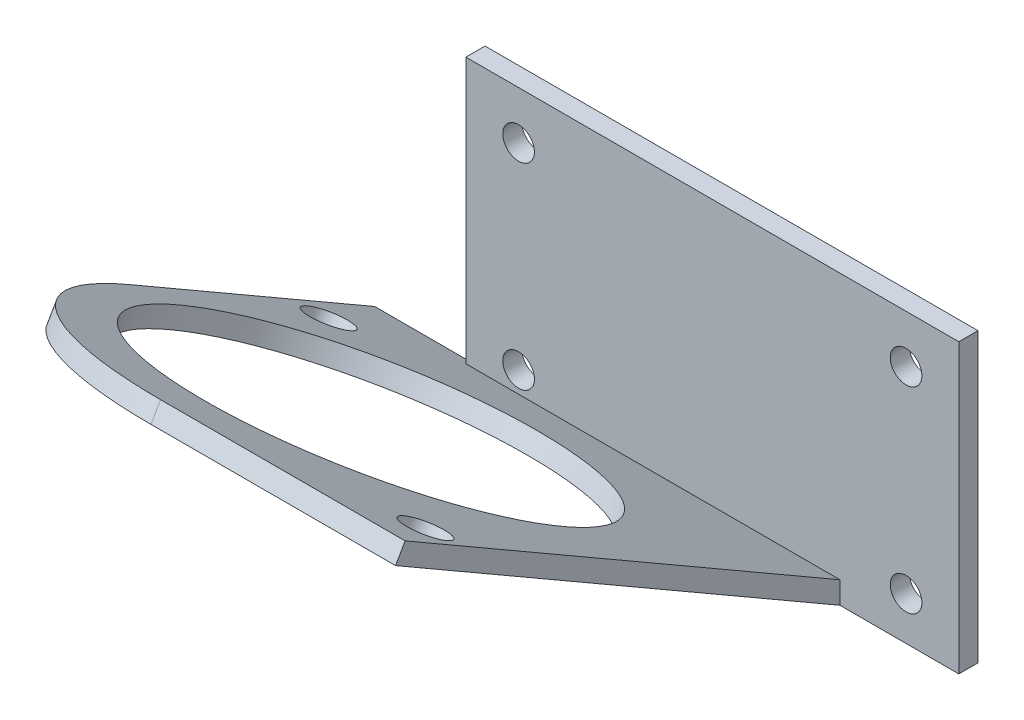
ISO-10303-21;
HEADER;
FILE_DESCRIPTION(('STEP AP214'),'2;1');
FILE_NAME('part.step','',(''),(''),'','','');
FILE_SCHEMA(('AUTOMOTIVE_DESIGN { 1 0 10303 214 1 1 1 1 }'));
ENDSEC;
DATA;
#1=APPLICATION_CONTEXT('core data for automotive mechanical design processes');
#2=APPLICATION_PROTOCOL_DEFINITION('international standard','automotive_design',2000,#1);
#3=PRODUCT_CONTEXT('',#1,'mechanical');
#4=PRODUCT('Part','Part','',(#3));
#5=PRODUCT_RELATED_PRODUCT_CATEGORY('part','',(#4));
#6=PRODUCT_DEFINITION_FORMATION('','',#4);
#7=PRODUCT_DEFINITION_CONTEXT('part definition',#1,'design');
#8=PRODUCT_DEFINITION('design','',#6,#7);
#9=PRODUCT_DEFINITION_SHAPE('','',#8);
#10=(LENGTH_UNIT() NAMED_UNIT(*) SI_UNIT(.MILLI.,.METRE.));
#11=(NAMED_UNIT(*) PLANE_ANGLE_UNIT() SI_UNIT($,.RADIAN.));
#12=(NAMED_UNIT(*) SI_UNIT($,.STERADIAN.) SOLID_ANGLE_UNIT());
#13=UNCERTAINTY_MEASURE_WITH_UNIT(LENGTH_MEASURE(1.E-05),#10,'distance_accuracy_value','');
#14=(GEOMETRIC_REPRESENTATION_CONTEXT(3) GLOBAL_UNCERTAINTY_ASSIGNED_CONTEXT((#13)) GLOBAL_UNIT_ASSIGNED_CONTEXT((#10,
#11,#12)) REPRESENTATION_CONTEXT('',''));
#15=CARTESIAN_POINT('',(0.,0.,0.));
#16=DIRECTION('',(0.,0.,1.));
#17=DIRECTION('',(1.,0.,0.));
#18=AXIS2_PLACEMENT_3D('',#15,#16,#17);
#19=CARTESIAN_POINT('',(0.,0.,2.));
#20=DIRECTION('',(1.,0.,0.));
#21=DIRECTION('',(0.,0.,-1.));
#22=AXIS2_PLACEMENT_3D('',#19,#20,#21);
#23=PLANE('',#22);
#24=DIRECTION('',(0.,0.,-1.));
#25=VECTOR('',#24,1.);
#26=CARTESIAN_POINT('',(0.,0.,2.));
#27=LINE('',#26,#25);
#28=CARTESIAN_POINT('',(0.,0.,2.));
#29=VERTEX_POINT('',#28);
#30=CARTESIAN_POINT('',(0.,0.,0.));
#31=VERTEX_POINT('',#30);
#32=EDGE_CURVE('E210',#29,#31,#27,.T.);
#33=ORIENTED_EDGE('',*,*,#32,.F.);
#34=DIRECTION('',(0.,0.86602540378444,-0.499999999999998));
#35=VECTOR('',#34,1.);
#36=CARTESIAN_POINT('',(0.,0.,2.));
#37=LINE('',#36,#35);
#38=CARTESIAN_POINT('',(0.,1.73205080756888,1.));
#39=VERTEX_POINT('',#38);
#40=EDGE_CURVE('E155',#29,#39,#37,.T.);
#41=ORIENTED_EDGE('',*,*,#40,.T.);
#42=DIRECTION('',(0.,-0.499999999999998,-0.86602540378444));
#43=VECTOR('',#42,1.);
#44=CARTESIAN_POINT('',(0.,1.73205080756888,1.));
#45=LINE('',#44,#43);
#46=CARTESIAN_POINT('',(0.,2.3094010767585,2.));
#47=VERTEX_POINT('',#46);
#48=EDGE_CURVE('E151',#47,#39,#45,.T.);
#49=ORIENTED_EDGE('',*,*,#48,.F.);
#50=DIRECTION('',(0.,-1.,0.));
#51=VECTOR('',#50,1.);
#52=CARTESIAN_POINT('',(0.,0.,2.));
#53=LINE('',#52,#51);
#54=CARTESIAN_POINT('',(0.,30.,2.));
#55=VERTEX_POINT('',#54);
#56=EDGE_CURVE('E182',#55,#47,#53,.T.);
#57=ORIENTED_EDGE('',*,*,#56,.F.);
#58=DIRECTION('',(0.,0.,-1.));
#59=VECTOR('',#58,1.);
#60=CARTESIAN_POINT('',(0.,30.,2.));
#61=LINE('',#60,#59);
#62=CARTESIAN_POINT('',(0.,30.,0.));
#63=VERTEX_POINT('',#62);
#64=EDGE_CURVE('E194',#55,#63,#61,.T.);
#65=ORIENTED_EDGE('',*,*,#64,.T.);
#66=DIRECTION('',(0.,-1.,0.));
#67=VECTOR('',#66,1.);
#68=CARTESIAN_POINT('',(0.,0.,0.));
#69=LINE('',#68,#67);
#70=EDGE_CURVE('E181',#63,#31,#69,.T.);
#71=ORIENTED_EDGE('',*,*,#70,.T.);
#72=EDGE_LOOP('',(#33,#41,#49,#57,#65,#71));
#73=FACE_BOUND('',#72,.T.);
#74=ADVANCED_FACE('F34',(#73),#23,.F.);
#75=CARTESIAN_POINT('',(0.,0.,2.));
#76=DIRECTION('',(0.,1.,0.));
#77=DIRECTION('',(0.,0.,1.));
#78=AXIS2_PLACEMENT_3D('',#75,#76,#77);
#79=PLANE('',#78);
#80=DIRECTION('',(1.,0.,0.));
#81=VECTOR('',#80,1.);
#82=CARTESIAN_POINT('',(0.,0.,0.));
#83=LINE('',#82,#81);
#84=CARTESIAN_POINT('',(51.4,0.,0.));
#85=VERTEX_POINT('',#84);
#86=EDGE_CURVE('E197',#31,#85,#83,.T.);
#87=ORIENTED_EDGE('',*,*,#86,.T.);
#88=DIRECTION('',(0.,0.,-1.));
#89=VECTOR('',#88,1.);
#90=CARTESIAN_POINT('',(51.4,0.,2.));
#91=LINE('',#90,#89);
#92=CARTESIAN_POINT('',(51.4,0.,2.));
#93=VERTEX_POINT('',#92);
#94=EDGE_CURVE('E207',#93,#85,#91,.T.);
#95=ORIENTED_EDGE('',*,*,#94,.F.);
#96=DIRECTION('',(1.,0.,0.));
#97=VECTOR('',#96,1.);
#98=CARTESIAN_POINT('',(0.,0.,2.));
#99=LINE('',#98,#97);
#100=CARTESIAN_POINT('',(39.,0.,2.));
#101=VERTEX_POINT('',#100);
#102=EDGE_CURVE('E185',#101,#93,#99,.T.);
#103=ORIENTED_EDGE('',*,*,#102,.F.);
#104=EDGE_CURVE('E187',#29,#101,#99,.T.);
#105=ORIENTED_EDGE('',*,*,#104,.F.);
#106=ORIENTED_EDGE('',*,*,#32,.T.);
#107=EDGE_LOOP('',(#87,#95,#103,#105,#106));
#108=FACE_BOUND('',#107,.T.);
#109=ADVANCED_FACE('F223',(#108),#79,.F.);
#110=CARTESIAN_POINT('',(51.4,0.,2.));
#111=DIRECTION('',(-1.,0.,0.));
#112=DIRECTION('',(0.,-1.,0.));
#113=AXIS2_PLACEMENT_3D('',#110,#111,#112);
#114=PLANE('',#113);
#115=DIRECTION('',(0.,1.,0.));
#116=VECTOR('',#115,1.);
#117=CARTESIAN_POINT('',(51.4,0.,0.));
#118=LINE('',#117,#116);
#119=CARTESIAN_POINT('',(51.4,30.,0.));
#120=VERTEX_POINT('',#119);
#121=EDGE_CURVE('E199',#85,#120,#118,.T.);
#122=ORIENTED_EDGE('',*,*,#121,.T.);
#123=DIRECTION('',(0.,0.,-1.));
#124=VECTOR('',#123,1.);
#125=CARTESIAN_POINT('',(51.4,30.,2.));
#126=LINE('',#125,#124);
#127=CARTESIAN_POINT('',(51.4,30.,2.));
#128=VERTEX_POINT('',#127);
#129=EDGE_CURVE('E204',#128,#120,#126,.T.);
#130=ORIENTED_EDGE('',*,*,#129,.F.);
#131=DIRECTION('',(0.,1.,0.));
#132=VECTOR('',#131,1.);
#133=CARTESIAN_POINT('',(51.4,0.,2.));
#134=LINE('',#133,#132);
#135=EDGE_CURVE('E190',#93,#128,#134,.T.);
#136=ORIENTED_EDGE('',*,*,#135,.F.);
#137=ORIENTED_EDGE('',*,*,#94,.T.);
#138=EDGE_LOOP('',(#122,#130,#136,#137));
#139=FACE_BOUND('',#138,.T.);
#140=ADVANCED_FACE('F246',(#139),#114,.F.);
#141=CARTESIAN_POINT('',(0.,30.,2.));
#142=DIRECTION('',(0.,-1.,0.));
#143=DIRECTION('',(0.,0.,-1.));
#144=AXIS2_PLACEMENT_3D('',#141,#142,#143);
#145=PLANE('',#144);
#146=DIRECTION('',(-1.,0.,0.));
#147=VECTOR('',#146,1.);
#148=CARTESIAN_POINT('',(0.,30.,0.));
#149=LINE('',#148,#147);
#150=EDGE_CURVE('E186',#120,#63,#149,.T.);
#151=ORIENTED_EDGE('',*,*,#150,.T.);
#152=ORIENTED_EDGE('',*,*,#64,.F.);
#153=DIRECTION('',(-1.,0.,0.));
#154=VECTOR('',#153,1.);
#155=CARTESIAN_POINT('',(0.,30.,2.));
#156=LINE('',#155,#154);
#157=EDGE_CURVE('E192',#128,#55,#156,.T.);
#158=ORIENTED_EDGE('',*,*,#157,.F.);
#159=ORIENTED_EDGE('',*,*,#129,.T.);
#160=EDGE_LOOP('',(#151,#152,#158,#159));
#161=FACE_BOUND('',#160,.T.);
#162=ADVANCED_FACE('F240',(#161),#145,.F.);
#163=CARTESIAN_POINT('',(0.,0.,2.));
#164=DIRECTION('',(0.,0.,-1.));
#165=DIRECTION('',(-1.,0.,0.));
#166=AXIS2_PLACEMENT_3D('',#163,#164,#165);
#167=PLANE('',#166);
#168=CARTESIAN_POINT('',(45.9,4.5,2.));
#169=DIRECTION('',(0.,0.,-1.));
#170=DIRECTION('',(-1.,0.,0.));
#171=AXIS2_PLACEMENT_3D('',#168,#169,#170);
#172=CIRCLE('',#171,1.65);
#173=CARTESIAN_POINT('',(44.25,4.5,2.));
#174=VERTEX_POINT('',#173);
#175=EDGE_CURVE('E178',#174,#174,#172,.T.);
#176=ORIENTED_EDGE('',*,*,#175,.T.);
#177=EDGE_LOOP('',(#176));
#178=FACE_BOUND('',#177,.T.);
#179=CARTESIAN_POINT('',(5.5,4.5,2.));
#180=DIRECTION('',(0.,0.,-1.));
#181=DIRECTION('',(-1.,0.,0.));
#182=AXIS2_PLACEMENT_3D('',#179,#180,#181);
#183=CIRCLE('',#182,1.65);
#184=CARTESIAN_POINT('',(3.85,4.5,2.));
#185=VERTEX_POINT('',#184);
#186=EDGE_CURVE('E175',#185,#185,#183,.T.);
#187=ORIENTED_EDGE('',*,*,#186,.T.);
#188=EDGE_LOOP('',(#187));
#189=FACE_BOUND('',#188,.T.);
#190=CARTESIAN_POINT('',(5.5,25.,2.));
#191=DIRECTION('',(0.,0.,-1.));
#192=DIRECTION('',(-1.,0.,0.));
#193=AXIS2_PLACEMENT_3D('',#190,#191,#192);
#194=CIRCLE('',#193,1.65);
#195=CARTESIAN_POINT('',(3.85,25.,2.));
#196=VERTEX_POINT('',#195);
#197=EDGE_CURVE('E172',#196,#196,#194,.T.);
#198=ORIENTED_EDGE('',*,*,#197,.T.);
#199=EDGE_LOOP('',(#198));
#200=FACE_BOUND('',#199,.T.);
#201=CARTESIAN_POINT('',(45.9,25.,2.));
#202=DIRECTION('',(0.,0.,-1.));
#203=DIRECTION('',(-1.,0.,0.));
#204=AXIS2_PLACEMENT_3D('',#201,#202,#203);
#205=CIRCLE('',#204,1.65);
#206=CARTESIAN_POINT('',(44.25,25.,2.));
#207=VERTEX_POINT('',#206);
#208=EDGE_CURVE('E169',#207,#207,#205,.T.);
#209=ORIENTED_EDGE('',*,*,#208,.T.);
#210=EDGE_LOOP('',(#209));
#211=FACE_BOUND('',#210,.T.);
#212=DIRECTION('',(-1.,0.,0.));
#213=VECTOR('',#212,1.);
#214=CARTESIAN_POINT('',(0.,2.3094010767585,2.));
#215=LINE('',#214,#213);
#216=CARTESIAN_POINT('',(39.,2.3094010767585,2.));
#217=VERTEX_POINT('',#216);
#218=EDGE_CURVE('E213',#217,#47,#215,.T.);
#219=ORIENTED_EDGE('',*,*,#218,.F.);
#220=DIRECTION('',(0.,-1.,0.));
#221=VECTOR('',#220,1.);
#222=CARTESIAN_POINT('',(39.,0.,2.));
#223=LINE('',#222,#221);
#224=EDGE_CURVE('E116',#217,#101,#223,.T.);
#225=ORIENTED_EDGE('',*,*,#224,.T.);
#226=ORIENTED_EDGE('',*,*,#102,.T.);
#227=ORIENTED_EDGE('',*,*,#135,.T.);
#228=ORIENTED_EDGE('',*,*,#157,.T.);
#229=ORIENTED_EDGE('',*,*,#56,.T.);
#230=EDGE_LOOP('',(#219,#225,#226,#227,#228,#229));
#231=FACE_BOUND('',#230,.T.);
#232=ADVANCED_FACE('F234',(#178,#189,#200,#211,#231),#167,.F.);
#233=CARTESIAN_POINT('',(0.,0.,0.));
#234=DIRECTION('',(0.,0.,-1.));
#235=DIRECTION('',(-1.,0.,0.));
#236=AXIS2_PLACEMENT_3D('',#233,#234,#235);
#237=PLANE('',#236);
#238=CARTESIAN_POINT('',(45.9,4.5,0.));
#239=DIRECTION('',(0.,0.,-1.));
#240=DIRECTION('',(-1.,0.,0.));
#241=AXIS2_PLACEMENT_3D('',#238,#239,#240);
#242=CIRCLE('',#241,1.65);
#243=CARTESIAN_POINT('',(44.25,4.5,0.));
#244=VERTEX_POINT('',#243);
#245=EDGE_CURVE('E157',#244,#244,#242,.T.);
#246=ORIENTED_EDGE('',*,*,#245,.F.);
#247=EDGE_LOOP('',(#246));
#248=FACE_BOUND('',#247,.T.);
#249=CARTESIAN_POINT('',(5.5,4.5,0.));
#250=DIRECTION('',(0.,0.,-1.));
#251=DIRECTION('',(-1.,0.,0.));
#252=AXIS2_PLACEMENT_3D('',#249,#250,#251);
#253=CIRCLE('',#252,1.65);
#254=CARTESIAN_POINT('',(3.85,4.5,0.));
#255=VERTEX_POINT('',#254);
#256=EDGE_CURVE('E162',#255,#255,#253,.T.);
#257=ORIENTED_EDGE('',*,*,#256,.F.);
#258=EDGE_LOOP('',(#257));
#259=FACE_BOUND('',#258,.T.);
#260=CARTESIAN_POINT('',(5.5,25.,0.));
#261=DIRECTION('',(0.,0.,-1.));
#262=DIRECTION('',(-1.,0.,0.));
#263=AXIS2_PLACEMENT_3D('',#260,#261,#262);
#264=CIRCLE('',#263,1.65);
#265=CARTESIAN_POINT('',(3.85,25.,0.));
#266=VERTEX_POINT('',#265);
#267=EDGE_CURVE('E158',#266,#266,#264,.T.);
#268=ORIENTED_EDGE('',*,*,#267,.F.);
#269=EDGE_LOOP('',(#268));
#270=FACE_BOUND('',#269,.T.);
#271=CARTESIAN_POINT('',(45.9,25.,0.));
#272=DIRECTION('',(0.,0.,-1.));
#273=DIRECTION('',(-1.,0.,0.));
#274=AXIS2_PLACEMENT_3D('',#271,#272,#273);
#275=CIRCLE('',#274,1.65);
#276=CARTESIAN_POINT('',(44.25,25.,0.));
#277=VERTEX_POINT('',#276);
#278=EDGE_CURVE('E161',#277,#277,#275,.T.);
#279=ORIENTED_EDGE('',*,*,#278,.F.);
#280=EDGE_LOOP('',(#279));
#281=FACE_BOUND('',#280,.T.);
#282=ORIENTED_EDGE('',*,*,#70,.F.);
#283=ORIENTED_EDGE('',*,*,#150,.F.);
#284=ORIENTED_EDGE('',*,*,#121,.F.);
#285=ORIENTED_EDGE('',*,*,#86,.F.);
#286=EDGE_LOOP('',(#282,#283,#284,#285));
#287=FACE_BOUND('',#286,.T.);
#288=ADVANCED_FACE('F243',(#248,#259,#270,#281,#287),#237,.T.);
#289=CARTESIAN_POINT('',(45.9,25.,10.));
#290=DIRECTION('',(0.,0.,-1.));
#291=DIRECTION('',(-1.,0.,0.));
#292=AXIS2_PLACEMENT_3D('',#289,#290,#291);
#293=CYLINDRICAL_SURFACE('',#292,1.65);
#294=ORIENTED_EDGE('',*,*,#278,.T.);
#295=EDGE_LOOP('',(#294));
#296=FACE_BOUND('',#295,.T.);
#297=ORIENTED_EDGE('',*,*,#208,.F.);
#298=EDGE_LOOP('',(#297));
#299=FACE_BOUND('',#298,.T.);
#300=ADVANCED_FACE('F378',(#296,#299),#293,.F.);
#301=CARTESIAN_POINT('',(5.5,25.,10.));
#302=DIRECTION('',(0.,0.,-1.));
#303=DIRECTION('',(-1.,0.,0.));
#304=AXIS2_PLACEMENT_3D('',#301,#302,#303);
#305=CYLINDRICAL_SURFACE('',#304,1.65);
#306=ORIENTED_EDGE('',*,*,#267,.T.);
#307=EDGE_LOOP('',(#306));
#308=FACE_BOUND('',#307,.T.);
#309=ORIENTED_EDGE('',*,*,#197,.F.);
#310=EDGE_LOOP('',(#309));
#311=FACE_BOUND('',#310,.T.);
#312=ADVANCED_FACE('F374',(#308,#311),#305,.F.);
#313=CARTESIAN_POINT('',(5.5,4.5,10.));
#314=DIRECTION('',(0.,0.,-1.));
#315=DIRECTION('',(-1.,0.,0.));
#316=AXIS2_PLACEMENT_3D('',#313,#314,#315);
#317=CYLINDRICAL_SURFACE('',#316,1.65);
#318=ORIENTED_EDGE('',*,*,#256,.T.);
#319=EDGE_LOOP('',(#318));
#320=FACE_BOUND('',#319,.T.);
#321=ORIENTED_EDGE('',*,*,#186,.F.);
#322=EDGE_LOOP('',(#321));
#323=FACE_BOUND('',#322,.T.);
#324=ADVANCED_FACE('F377',(#320,#323),#317,.F.);
#325=CARTESIAN_POINT('',(45.9,4.5,10.));
#326=DIRECTION('',(0.,0.,-1.));
#327=DIRECTION('',(-1.,0.,0.));
#328=AXIS2_PLACEMENT_3D('',#325,#326,#327);
#329=CYLINDRICAL_SURFACE('',#328,1.65);
#330=ORIENTED_EDGE('',*,*,#245,.T.);
#331=EDGE_LOOP('',(#330));
#332=FACE_BOUND('',#331,.T.);
#333=ORIENTED_EDGE('',*,*,#175,.F.);
#334=EDGE_LOOP('',(#333));
#335=FACE_BOUND('',#334,.T.);
#336=ADVANCED_FACE('F285',(#332,#335),#329,.F.);
#337=CARTESIAN_POINT('',(39.,1.73205080756888,1.));
#338=DIRECTION('',(1.,0.,0.));
#339=DIRECTION('',(0.,0.,-1.));
#340=AXIS2_PLACEMENT_3D('',#337,#338,#339);
#341=PLANE('',#340);
#342=ORIENTED_EDGE('',*,*,#224,.F.);
#343=DIRECTION('',(0.,0.499999999999998,0.86602540378444));
#344=VECTOR('',#343,1.);
#345=CARTESIAN_POINT('',(39.,1.73205080756888,1.));
#346=LINE('',#345,#344);
#347=CARTESIAN_POINT('',(39.,28.4820508075688,47.3323591024675));
#348=VERTEX_POINT('',#347);
#349=EDGE_CURVE('E109',#217,#348,#346,.T.);
#350=ORIENTED_EDGE('',*,*,#349,.T.);
#351=DIRECTION('',(0.,-0.86602540378444,0.499999999999998));
#352=VECTOR('',#351,1.);
#353=CARTESIAN_POINT('',(39.,28.4820508075688,47.3323591024675));
#354=LINE('',#353,#352);
#355=CARTESIAN_POINT('',(39.,26.7499999999999,48.3323591024675));
#356=VERTEX_POINT('',#355);
#357=EDGE_CURVE('E113',#348,#356,#354,.T.);
#358=ORIENTED_EDGE('',*,*,#357,.T.);
#359=DIRECTION('',(0.,0.499999999999998,0.86602540378444));
#360=VECTOR('',#359,1.);
#361=CARTESIAN_POINT('',(39.,0.,2.));
#362=LINE('',#361,#360);
#363=EDGE_CURVE('E142',#101,#356,#362,.T.);
#364=ORIENTED_EDGE('',*,*,#363,.F.);
#365=EDGE_LOOP('',(#342,#350,#358,#364));
#366=FACE_BOUND('',#365,.T.);
#367=ADVANCED_FACE('F111',(#366),#341,.T.);
#368=CARTESIAN_POINT('',(39.,1.73205080756888,1.));
#369=DIRECTION('',(0.,-0.499999999999998,-0.86602540378444));
#370=DIRECTION('',(0.,0.86602540378444,-0.499999999999998));
#371=AXIS2_PLACEMENT_3D('',#368,#369,#370);
#372=PLANE('',#371);
#373=ORIENTED_EDGE('',*,*,#40,.F.);
#374=DIRECTION('',(1.,0.,0.));
#375=VECTOR('',#374,1.);
#376=CARTESIAN_POINT('',(39.,0.,2.));
#377=LINE('',#376,#375);
#378=CARTESIAN_POINT('',(-10.5,0.,2.));
#379=VERTEX_POINT('',#378);
#380=EDGE_CURVE('E121',#379,#29,#377,.T.);
#381=ORIENTED_EDGE('',*,*,#380,.F.);
#382=DIRECTION('',(0.,-0.86602540378444,0.499999999999998));
#383=VECTOR('',#382,1.);
#384=CARTESIAN_POINT('',(-10.5,1.73205080756888,1.));
#385=LINE('',#384,#383);
#386=CARTESIAN_POINT('',(-10.5,1.73205080756888,1.));
#387=VERTEX_POINT('',#386);
#388=EDGE_CURVE('E130',#387,#379,#385,.T.);
#389=ORIENTED_EDGE('',*,*,#388,.F.);
#390=DIRECTION('',(1.,0.,0.));
#391=VECTOR('',#390,1.);
#392=CARTESIAN_POINT('',(39.,1.73205080756888,1.));
#393=LINE('',#392,#391);
#394=EDGE_CURVE('E131',#387,#39,#393,.T.);
#395=ORIENTED_EDGE('',*,*,#394,.T.);
#396=EDGE_LOOP('',(#373,#381,#389,#395));
#397=FACE_BOUND('',#396,.T.);
#398=ADVANCED_FACE('F229',(#397),#372,.T.);
#399=CARTESIAN_POINT('',(0.,0.866025403784442,-0.499999999999999));
#400=DIRECTION('',(0.,-0.86602540378444,0.499999999999998));
#401=DIRECTION('',(0.,-0.499999999999998,-0.86602540378444));
#402=AXIS2_PLACEMENT_3D('',#399,#400,#401);
#403=PLANE('',#402);
#404=CARTESIAN_POINT('',(12.9000000000008,15.4714007732929,24.7972522036039));
#405=DIRECTION('',(0.,-0.86602540378444,0.499999999999998));
#406=DIRECTION('',(0.,-0.499999999999998,-0.86602540378444));
#407=AXIS2_PLACEMENT_3D('',#404,#405,#406);
#408=CIRCLE('',#407,20.);
#409=CARTESIAN_POINT('',(12.9000000000008,5.47140077329298,7.47674412791513));
#410=VERTEX_POINT('',#409);
#411=EDGE_CURVE('E443',#410,#410,#408,.T.);
#412=ORIENTED_EDGE('',*,*,#411,.T.);
#413=EDGE_LOOP('',(#412));
#414=FACE_BOUND('',#413,.T.);
#415=CARTESIAN_POINT('',(35.9000000000889,25.4714007733215,42.1177602793422));
#416=DIRECTION('',(0.,-0.86602540378444,0.499999999999998));
#417=DIRECTION('',(0.,-0.499999999999998,-0.86602540378444));
#418=AXIS2_PLACEMENT_3D('',#415,#416,#417);
#419=CIRCLE('',#418,2.25);
#420=CARTESIAN_POINT('',(35.9000000000889,24.3464007733215,40.1692031208272));
#421=VERTEX_POINT('',#420);
#422=EDGE_CURVE('E144',#421,#421,#419,.T.);
#423=ORIENTED_EDGE('',*,*,#422,.T.);
#424=EDGE_LOOP('',(#423));
#425=FACE_BOUND('',#424,.T.);
#426=CARTESIAN_POINT('',(-7.09999999991122,6.47140077332162,9.20879493553361));
#427=DIRECTION('',(0.,-0.86602540378444,0.499999999999998));
#428=DIRECTION('',(0.,-0.499999999999998,-0.86602540378444));
#429=AXIS2_PLACEMENT_3D('',#426,#427,#428);
#430=CIRCLE('',#429,2.25);
#431=CARTESIAN_POINT('',(-7.09999999991122,5.34640077332162,7.26023777701863));
#432=VERTEX_POINT('',#431);
#433=EDGE_CURVE('E456',#432,#432,#430,.T.);
#434=ORIENTED_EDGE('',*,*,#433,.T.);
#435=EDGE_LOOP('',(#434));
#436=FACE_BOUND('',#435,.T.);
#437=DIRECTION('',(0.,-0.499999999999998,-0.86602540378444));
#438=VECTOR('',#437,1.);
#439=CARTESIAN_POINT('',(-10.5,1.73205080756888,1.));
#440=LINE('',#439,#438);
#441=CARTESIAN_POINT('',(-10.5,16.4820508075688,26.547749411641));
#442=VERTEX_POINT('',#441);
#443=EDGE_CURVE('E135',#442,#387,#440,.T.);
#444=ORIENTED_EDGE('',*,*,#443,.F.);
#445=CARTESIAN_POINT('',(13.5,16.4820508075688,26.547749411641));
#446=DIRECTION('',(0.,-0.86602540378444,0.499999999999998));
#447=DIRECTION('',(0.,-0.499999999999998,-0.86602540378444));
#448=AXIS2_PLACEMENT_3D('',#445,#446,#447);
#449=CIRCLE('',#448,24.);
#450=CARTESIAN_POINT('',(13.5,28.4820508075688,47.3323591024675));
#451=VERTEX_POINT('',#450);
#452=EDGE_CURVE('E11',#442,#451,#449,.F.);
#453=ORIENTED_EDGE('',*,*,#452,.T.);
#454=DIRECTION('',(-1.,0.,0.));
#455=VECTOR('',#454,1.);
#456=CARTESIAN_POINT('',(39.,28.4820508075688,47.3323591024675));
#457=LINE('',#456,#455);
#458=EDGE_CURVE('E120',#348,#451,#457,.T.);
#459=ORIENTED_EDGE('',*,*,#458,.F.);
#460=ORIENTED_EDGE('',*,*,#349,.F.);
#461=ORIENTED_EDGE('',*,*,#218,.T.);
#462=ORIENTED_EDGE('',*,*,#48,.T.);
#463=ORIENTED_EDGE('',*,*,#394,.F.);
#464=EDGE_LOOP('',(#444,#453,#459,#460,#461,#462,#463));
#465=FACE_BOUND('',#464,.T.);
#466=ADVANCED_FACE('F133',(#414,#425,#436,#465),#403,.F.);
#467=CARTESIAN_POINT('',(-10.5,1.73205080756888,1.));
#468=DIRECTION('',(-1.,0.,0.));
#469=DIRECTION('',(0.,0.,1.));
#470=AXIS2_PLACEMENT_3D('',#467,#468,#469);
#471=PLANE('',#470);
#472=DIRECTION('',(0.,-0.499999999999998,-0.86602540378444));
#473=VECTOR('',#472,1.);
#474=CARTESIAN_POINT('',(-10.5,0.,2.));
#475=LINE('',#474,#473);
#476=CARTESIAN_POINT('',(-10.5,14.7499999999999,27.547749411641));
#477=VERTEX_POINT('',#476);
#478=EDGE_CURVE('E146',#477,#379,#475,.T.);
#479=ORIENTED_EDGE('',*,*,#478,.F.);
#480=DIRECTION('',(0.,-0.86602540378444,0.499999999999998));
#481=VECTOR('',#480,1.);
#482=CARTESIAN_POINT('',(-10.5,16.4820508075688,26.547749411641));
#483=LINE('',#482,#481);
#484=EDGE_CURVE('E42',#477,#442,#483,.F.);
#485=ORIENTED_EDGE('',*,*,#484,.T.);
#486=ORIENTED_EDGE('',*,*,#443,.T.);
#487=ORIENTED_EDGE('',*,*,#388,.T.);
#488=EDGE_LOOP('',(#479,#485,#486,#487));
#489=FACE_BOUND('',#488,.T.);
#490=ADVANCED_FACE('F302',(#489),#471,.T.);
#491=CARTESIAN_POINT('',(39.,28.4820508075688,47.3323591024675));
#492=DIRECTION('',(0.,0.499999999999998,0.86602540378444));
#493=DIRECTION('',(0.,-0.86602540378444,0.499999999999998));
#494=AXIS2_PLACEMENT_3D('',#491,#492,#493);
#495=PLANE('',#494);
#496=ORIENTED_EDGE('',*,*,#458,.T.);
#497=DIRECTION('',(0.,-0.86602540378444,0.499999999999998));
#498=VECTOR('',#497,1.);
#499=CARTESIAN_POINT('',(13.5,28.4820508075688,47.3323591024675));
#500=LINE('',#499,#498);
#501=CARTESIAN_POINT('',(13.5,26.7499999999999,48.3323591024675));
#502=VERTEX_POINT('',#501);
#503=EDGE_CURVE('E216',#451,#502,#500,.T.);
#504=ORIENTED_EDGE('',*,*,#503,.T.);
#505=DIRECTION('',(-1.,0.,0.));
#506=VECTOR('',#505,1.);
#507=CARTESIAN_POINT('',(39.,26.7499999999999,48.3323591024675));
#508=LINE('',#507,#506);
#509=EDGE_CURVE('E128',#356,#502,#508,.T.);
#510=ORIENTED_EDGE('',*,*,#509,.F.);
#511=ORIENTED_EDGE('',*,*,#357,.F.);
#512=EDGE_LOOP('',(#496,#504,#510,#511));
#513=FACE_BOUND('',#512,.T.);
#514=ADVANCED_FACE('F125',(#513),#495,.T.);
#515=CARTESIAN_POINT('',(0.,-0.866025403784438,0.499999999999997));
#516=DIRECTION('',(0.,-0.86602540378444,0.499999999999998));
#517=DIRECTION('',(0.,-0.499999999999998,-0.86602540378444));
#518=AXIS2_PLACEMENT_3D('',#515,#516,#517);
#519=PLANE('',#518);
#520=CARTESIAN_POINT('',(12.9000000000008,13.7393499657241,25.7972522036039));
#521=DIRECTION('',(0.,-0.86602540378444,0.499999999999998));
#522=DIRECTION('',(0.,-0.499999999999998,-0.86602540378444));
#523=AXIS2_PLACEMENT_3D('',#520,#521,#522);
#524=CIRCLE('',#523,20.);
#525=CARTESIAN_POINT('',(12.9000000000008,3.7393499657241,8.47674412791513));
#526=VERTEX_POINT('',#525);
#527=EDGE_CURVE('E446',#526,#526,#524,.T.);
#528=ORIENTED_EDGE('',*,*,#527,.F.);
#529=EDGE_LOOP('',(#528));
#530=FACE_BOUND('',#529,.T.);
#531=CARTESIAN_POINT('',(35.9000000000889,23.7393499657526,43.1177602793422));
#532=DIRECTION('',(0.,-0.86602540378444,0.499999999999998));
#533=DIRECTION('',(0.,-0.499999999999998,-0.86602540378444));
#534=AXIS2_PLACEMENT_3D('',#531,#532,#533);
#535=CIRCLE('',#534,2.25);
#536=CARTESIAN_POINT('',(35.9000000000889,22.6143499657526,41.1692031208272));
#537=VERTEX_POINT('',#536);
#538=EDGE_CURVE('E453',#537,#537,#535,.T.);
#539=ORIENTED_EDGE('',*,*,#538,.F.);
#540=EDGE_LOOP('',(#539));
#541=FACE_BOUND('',#540,.T.);
#542=CARTESIAN_POINT('',(-7.09999999991122,4.73934996575274,10.2087949355336));
#543=DIRECTION('',(0.,-0.86602540378444,0.499999999999998));
#544=DIRECTION('',(0.,-0.499999999999998,-0.86602540378444));
#545=AXIS2_PLACEMENT_3D('',#542,#543,#544);
#546=CIRCLE('',#545,2.25);
#547=CARTESIAN_POINT('',(-7.09999999991122,3.61434996575274,8.26023777701862));
#548=VERTEX_POINT('',#547);
#549=EDGE_CURVE('E448',#548,#548,#546,.T.);
#550=ORIENTED_EDGE('',*,*,#549,.F.);
#551=EDGE_LOOP('',(#550));
#552=FACE_BOUND('',#551,.T.);
#553=ORIENTED_EDGE('',*,*,#509,.T.);
#554=CARTESIAN_POINT('',(13.5,14.7499999999999,27.547749411641));
#555=DIRECTION('',(0.,-0.86602540378444,0.499999999999998));
#556=DIRECTION('',(0.,-0.499999999999998,-0.86602540378444));
#557=AXIS2_PLACEMENT_3D('',#554,#555,#556);
#558=CIRCLE('',#557,24.);
#559=EDGE_CURVE('E56',#502,#477,#558,.T.);
#560=ORIENTED_EDGE('',*,*,#559,.T.);
#561=ORIENTED_EDGE('',*,*,#478,.T.);
#562=ORIENTED_EDGE('',*,*,#380,.T.);
#563=ORIENTED_EDGE('',*,*,#104,.T.);
#564=ORIENTED_EDGE('',*,*,#363,.T.);
#565=EDGE_LOOP('',(#553,#560,#561,#562,#563,#564));
#566=FACE_BOUND('',#565,.T.);
#567=ADVANCED_FACE('F219',(#530,#541,#552,#566),#519,.T.);
#568=CARTESIAN_POINT('',(13.5,16.4820508075688,26.547749411641));
#569=DIRECTION('',(0.,-0.86602540378444,0.499999999999998));
#570=DIRECTION('',(0.,-0.499999999999998,-0.86602540378444));
#571=AXIS2_PLACEMENT_3D('',#568,#569,#570);
#572=CYLINDRICAL_SURFACE('',#571,24.);
#573=ORIENTED_EDGE('',*,*,#452,.F.);
#574=ORIENTED_EDGE('',*,*,#484,.F.);
#575=ORIENTED_EDGE('',*,*,#559,.F.);
#576=ORIENTED_EDGE('',*,*,#503,.F.);
#577=EDGE_LOOP('',(#573,#574,#575,#576));
#578=FACE_BOUND('',#577,.T.);
#579=ADVANCED_FACE('F36',(#578),#572,.T.);
#580=CARTESIAN_POINT('',(-7.09999999991122,6.47140077332162,9.20879493553361));
#581=DIRECTION('',(0.,-0.86602540378444,0.499999999999998));
#582=DIRECTION('',(0.,-0.499999999999998,-0.86602540378444));
#583=AXIS2_PLACEMENT_3D('',#580,#581,#582);
#584=CYLINDRICAL_SURFACE('',#583,2.25);
#585=ORIENTED_EDGE('',*,*,#433,.F.);
#586=EDGE_LOOP('',(#585));
#587=FACE_BOUND('',#586,.T.);
#588=ORIENTED_EDGE('',*,*,#549,.T.);
#589=EDGE_LOOP('',(#588));
#590=FACE_BOUND('',#589,.T.);
#591=ADVANCED_FACE('F325',(#587,#590),#584,.F.);
#592=CARTESIAN_POINT('',(35.9000000000889,25.4714007733215,42.1177602793422));
#593=DIRECTION('',(0.,-0.86602540378444,0.499999999999998));
#594=DIRECTION('',(0.,-0.499999999999998,-0.86602540378444));
#595=AXIS2_PLACEMENT_3D('',#592,#593,#594);
#596=CYLINDRICAL_SURFACE('',#595,2.25);
#597=ORIENTED_EDGE('',*,*,#422,.F.);
#598=EDGE_LOOP('',(#597));
#599=FACE_BOUND('',#598,.T.);
#600=ORIENTED_EDGE('',*,*,#538,.T.);
#601=EDGE_LOOP('',(#600));
#602=FACE_BOUND('',#601,.T.);
#603=ADVANCED_FACE('F333',(#599,#602),#596,.F.);
#604=CARTESIAN_POINT('',(12.9000000000008,15.4714007732929,24.7972522036039));
#605=DIRECTION('',(0.,-0.86602540378444,0.499999999999998));
#606=DIRECTION('',(0.,-0.499999999999998,-0.86602540378444));
#607=AXIS2_PLACEMENT_3D('',#604,#605,#606);
#608=CYLINDRICAL_SURFACE('',#607,20.);
#609=ORIENTED_EDGE('',*,*,#411,.F.);
#610=EDGE_LOOP('',(#609));
#611=FACE_BOUND('',#610,.T.);
#612=ORIENTED_EDGE('',*,*,#527,.T.);
#613=EDGE_LOOP('',(#612));
#614=FACE_BOUND('',#613,.T.);
#615=ADVANCED_FACE('F343',(#611,#614),#608,.F.);
#616=CLOSED_SHELL('',(#74,#109,#140,#162,#232,#288,#300,#312,#324,#336,#367,#398,#466,#490,#514,
#567,#579,#591,#603,#615));
#617=MANIFOLD_SOLID_BREP('B2',#616);
#618=ADVANCED_BREP_SHAPE_REPRESENTATION('',(#18,#617),#14);
#619=SHAPE_DEFINITION_REPRESENTATION(#9,#618);
ENDSEC;
END-ISO-10303-21;
